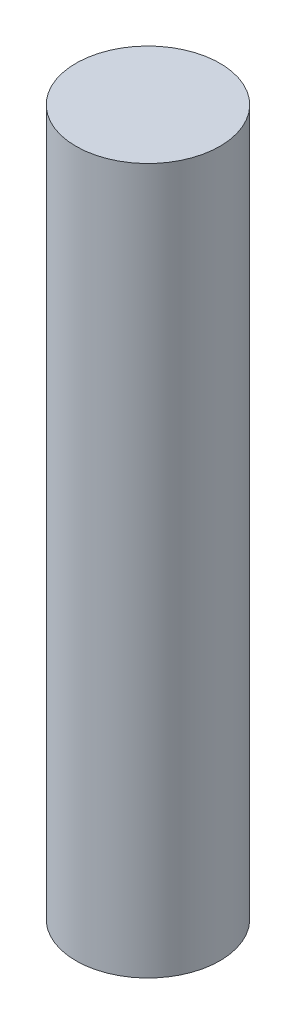
ISO-10303-21;
HEADER;
FILE_DESCRIPTION(('STEP AP214'),'2;1');
FILE_NAME('part.step','',(''),(''),'','','');
FILE_SCHEMA(('AUTOMOTIVE_DESIGN { 1 0 10303 214 1 1 1 1 }'));
ENDSEC;
DATA;
#1=APPLICATION_CONTEXT('core data for automotive mechanical design processes');
#2=APPLICATION_PROTOCOL_DEFINITION('international standard','automotive_design',2000,#1);
#3=PRODUCT_CONTEXT('',#1,'mechanical');
#4=PRODUCT('Part','Part','',(#3));
#5=PRODUCT_RELATED_PRODUCT_CATEGORY('part','',(#4));
#6=PRODUCT_DEFINITION_FORMATION('','',#4);
#7=PRODUCT_DEFINITION_CONTEXT('part definition',#1,'design');
#8=PRODUCT_DEFINITION('design','',#6,#7);
#9=PRODUCT_DEFINITION_SHAPE('','',#8);
#10=(LENGTH_UNIT() NAMED_UNIT(*) SI_UNIT(.MILLI.,.METRE.));
#11=(NAMED_UNIT(*) PLANE_ANGLE_UNIT() SI_UNIT($,.RADIAN.));
#12=(NAMED_UNIT(*) SI_UNIT($,.STERADIAN.) SOLID_ANGLE_UNIT());
#13=UNCERTAINTY_MEASURE_WITH_UNIT(LENGTH_MEASURE(1.E-05),#10,'distance_accuracy_value','');
#14=(GEOMETRIC_REPRESENTATION_CONTEXT(3) GLOBAL_UNCERTAINTY_ASSIGNED_CONTEXT((#13)) GLOBAL_UNIT_ASSIGNED_CONTEXT((#10,
#11,#12)) REPRESENTATION_CONTEXT('',''));
#15=CARTESIAN_POINT('',(0.,0.,0.));
#16=DIRECTION('',(0.,0.,1.));
#17=DIRECTION('',(1.,0.,0.));
#18=AXIS2_PLACEMENT_3D('',#15,#16,#17);
#19=CARTESIAN_POINT('',(0.,49.,0.));
#20=DIRECTION('',(0.,-1.,0.));
#21=DIRECTION('',(0.,0.,-1.));
#22=AXIS2_PLACEMENT_3D('',#19,#20,#21);
#23=CYLINDRICAL_SURFACE('',#22,5.);
#24=CARTESIAN_POINT('',(0.,49.,0.));
#25=DIRECTION('',(0.,1.,0.));
#26=DIRECTION('',(0.,0.,1.));
#27=AXIS2_PLACEMENT_3D('',#24,#25,#26);
#28=CIRCLE('',#27,5.);
#29=CARTESIAN_POINT('',(0.,49.,5.));
#30=VERTEX_POINT('',#29);
#31=EDGE_CURVE('E10',#30,#30,#28,.T.);
#32=ORIENTED_EDGE('',*,*,#31,.F.);
#33=EDGE_LOOP('',(#32));
#34=FACE_BOUND('',#33,.T.);
#35=CARTESIAN_POINT('',(0.,0.,0.));
#36=DIRECTION('',(0.,1.,0.));
#37=DIRECTION('',(0.,0.,1.));
#38=AXIS2_PLACEMENT_3D('',#35,#36,#37);
#39=CIRCLE('',#38,5.);
#40=CARTESIAN_POINT('',(0.,0.,5.));
#41=VERTEX_POINT('',#40);
#42=EDGE_CURVE('E34',#41,#41,#39,.T.);
#43=ORIENTED_EDGE('',*,*,#42,.T.);
#44=EDGE_LOOP('',(#43));
#45=FACE_BOUND('',#44,.T.);
#46=ADVANCED_FACE('F31',(#34,#45),#23,.T.);
#47=CARTESIAN_POINT('',(0.,49.,0.));
#48=DIRECTION('',(0.,1.,0.));
#49=DIRECTION('',(0.,0.,1.));
#50=AXIS2_PLACEMENT_3D('',#47,#48,#49);
#51=PLANE('',#50);
#52=ORIENTED_EDGE('',*,*,#31,.T.);
#53=EDGE_LOOP('',(#52));
#54=FACE_BOUND('',#53,.T.);
#55=ADVANCED_FACE('F46',(#54),#51,.T.);
#56=CARTESIAN_POINT('',(0.,0.,0.));
#57=DIRECTION('',(0.,1.,0.));
#58=DIRECTION('',(0.,0.,1.));
#59=AXIS2_PLACEMENT_3D('',#56,#57,#58);
#60=PLANE('',#59);
#61=ORIENTED_EDGE('',*,*,#42,.F.);
#62=EDGE_LOOP('',(#61));
#63=FACE_BOUND('',#62,.T.);
#64=ADVANCED_FACE('F44',(#63),#60,.F.);
#65=CLOSED_SHELL('',(#46,#55,#64));
#66=MANIFOLD_SOLID_BREP('B2',#65);
#67=ADVANCED_BREP_SHAPE_REPRESENTATION('',(#18,#66),#14);
#68=SHAPE_DEFINITION_REPRESENTATION(#9,#67);
ENDSEC;
END-ISO-10303-21;
